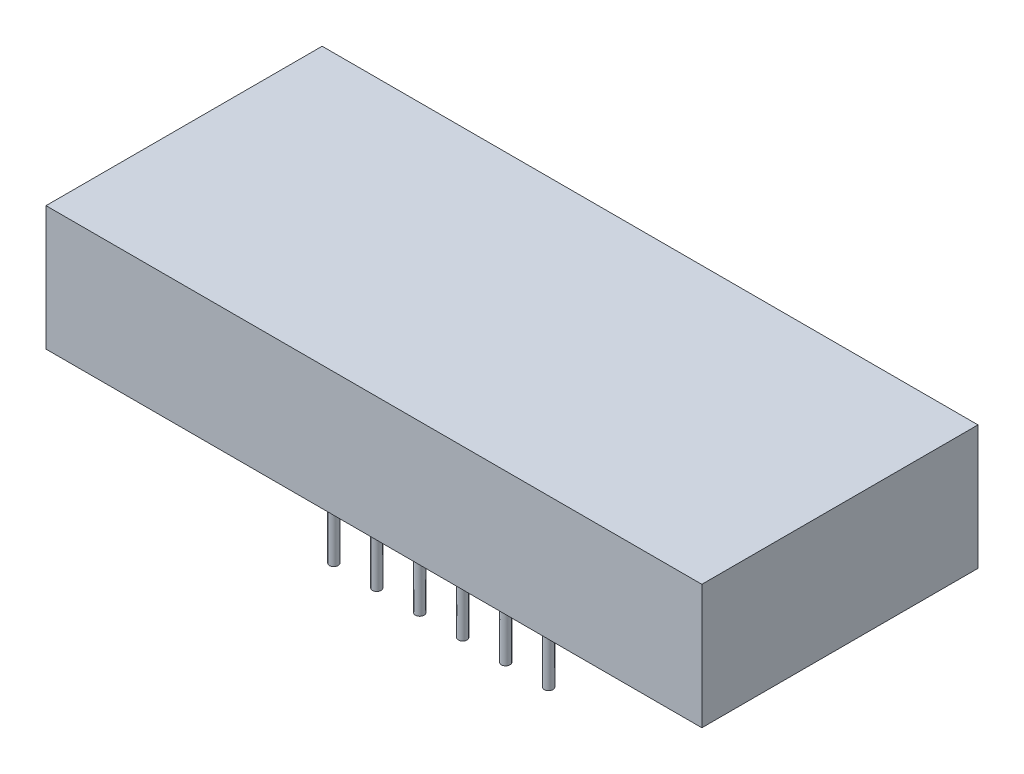
ISO-10303-21;
HEADER;
FILE_DESCRIPTION(('STEP AP214'),'2;1');
FILE_NAME('part.step','',(''),(''),'','','');
FILE_SCHEMA(('AUTOMOTIVE_DESIGN { 1 0 10303 214 1 1 1 1 }'));
ENDSEC;
DATA;
#1=APPLICATION_CONTEXT('core data for automotive mechanical design processes');
#2=APPLICATION_PROTOCOL_DEFINITION('international standard','automotive_design',2000,#1);
#3=PRODUCT_CONTEXT('',#1,'mechanical');
#4=PRODUCT('Part','Part','',(#3));
#5=PRODUCT_RELATED_PRODUCT_CATEGORY('part','',(#4));
#6=PRODUCT_DEFINITION_FORMATION('','',#4);
#7=PRODUCT_DEFINITION_CONTEXT('part definition',#1,'design');
#8=PRODUCT_DEFINITION('design','',#6,#7);
#9=PRODUCT_DEFINITION_SHAPE('','',#8);
#10=(LENGTH_UNIT() NAMED_UNIT(*) SI_UNIT(.MILLI.,.METRE.));
#11=(NAMED_UNIT(*) PLANE_ANGLE_UNIT() SI_UNIT($,.RADIAN.));
#12=(NAMED_UNIT(*) SI_UNIT($,.STERADIAN.) SOLID_ANGLE_UNIT());
#13=UNCERTAINTY_MEASURE_WITH_UNIT(LENGTH_MEASURE(1.E-05),#10,'distance_accuracy_value','');
#14=(GEOMETRIC_REPRESENTATION_CONTEXT(3) GLOBAL_UNCERTAINTY_ASSIGNED_CONTEXT((#13)) GLOBAL_UNIT_ASSIGNED_CONTEXT((#10,
#11,#12)) REPRESENTATION_CONTEXT('',''));
#15=CARTESIAN_POINT('',(0.,0.,0.));
#16=DIRECTION('',(0.,0.,1.));
#17=DIRECTION('',(1.,0.,0.));
#18=AXIS2_PLACEMENT_3D('',#15,#16,#17);
#19=CARTESIAN_POINT('',(-19.,0.,8.));
#20=DIRECTION('',(0.,1.,0.));
#21=DIRECTION('',(0.,0.,1.));
#22=AXIS2_PLACEMENT_3D('',#19,#20,#21);
#23=PLANE('',#22);
#24=CARTESIAN_POINT('',(3.73481199421592,0.,-4.1));
#25=DIRECTION('',(0.,1.,0.));
#26=DIRECTION('',(0.,0.,1.));
#27=AXIS2_PLACEMENT_3D('',#24,#25,#26);
#28=CIRCLE('',#27,0.250000000000001);
#29=CARTESIAN_POINT('',(3.73481199421592,0.,-3.85));
#30=VERTEX_POINT('',#29);
#31=EDGE_CURVE('E40',#30,#30,#28,.F.);
#32=ORIENTED_EDGE('',*,*,#31,.F.);
#33=EDGE_LOOP('',(#32));
#34=FACE_BOUND('',#33,.T.);
#35=CARTESIAN_POINT('',(-1.2449373314053,0.,-4.1));
#36=DIRECTION('',(0.,1.,0.));
#37=DIRECTION('',(0.,0.,1.));
#38=AXIS2_PLACEMENT_3D('',#35,#36,#37);
#39=CIRCLE('',#38,0.25);
#40=CARTESIAN_POINT('',(-1.2449373314053,0.,-3.85));
#41=VERTEX_POINT('',#40);
#42=EDGE_CURVE('E138',#41,#41,#39,.F.);
#43=ORIENTED_EDGE('',*,*,#42,.F.);
#44=EDGE_LOOP('',(#43));
#45=FACE_BOUND('',#44,.T.);
#46=CARTESIAN_POINT('',(-6.22468665702653,0.,-4.10000000000001));
#47=DIRECTION('',(0.,1.,0.));
#48=DIRECTION('',(0.,0.,1.));
#49=AXIS2_PLACEMENT_3D('',#46,#47,#48);
#50=CIRCLE('',#49,0.25);
#51=CARTESIAN_POINT('',(-6.22468665702653,0.,-3.85000000000001));
#52=VERTEX_POINT('',#51);
#53=EDGE_CURVE('E132',#52,#52,#50,.F.);
#54=ORIENTED_EDGE('',*,*,#53,.F.);
#55=EDGE_LOOP('',(#54));
#56=FACE_BOUND('',#55,.T.);
#57=CARTESIAN_POINT('',(-3.73481199421592,0.,4.1));
#58=DIRECTION('',(0.,1.,0.));
#59=DIRECTION('',(0.,0.,1.));
#60=AXIS2_PLACEMENT_3D('',#57,#58,#59);
#61=CIRCLE('',#60,0.25);
#62=CARTESIAN_POINT('',(-3.73481199421592,0.,4.35));
#63=VERTEX_POINT('',#62);
#64=EDGE_CURVE('E126',#63,#63,#61,.F.);
#65=ORIENTED_EDGE('',*,*,#64,.F.);
#66=EDGE_LOOP('',(#65));
#67=FACE_BOUND('',#66,.T.);
#68=CARTESIAN_POINT('',(1.24493733140531,0.,4.1));
#69=DIRECTION('',(0.,1.,0.));
#70=DIRECTION('',(0.,0.,1.));
#71=AXIS2_PLACEMENT_3D('',#68,#69,#70);
#72=CIRCLE('',#71,0.25);
#73=CARTESIAN_POINT('',(1.24493733140531,0.,4.35));
#74=VERTEX_POINT('',#73);
#75=EDGE_CURVE('E120',#74,#74,#72,.F.);
#76=ORIENTED_EDGE('',*,*,#75,.F.);
#77=EDGE_LOOP('',(#76));
#78=FACE_BOUND('',#77,.T.);
#79=CARTESIAN_POINT('',(6.22468665702653,0.,4.1));
#80=DIRECTION('',(0.,1.,0.));
#81=DIRECTION('',(0.,0.,1.));
#82=AXIS2_PLACEMENT_3D('',#79,#80,#81);
#83=CIRCLE('',#82,0.25);
#84=CARTESIAN_POINT('',(6.22468665702653,0.,4.35));
#85=VERTEX_POINT('',#84);
#86=EDGE_CURVE('E90',#85,#85,#83,.F.);
#87=ORIENTED_EDGE('',*,*,#86,.F.);
#88=EDGE_LOOP('',(#87));
#89=FACE_BOUND('',#88,.T.);
#90=DIRECTION('',(0.,0.,1.));
#91=VECTOR('',#90,1.);
#92=CARTESIAN_POINT('',(-19.,0.,-8.));
#93=LINE('',#92,#91);
#94=CARTESIAN_POINT('',(-19.,0.,-8.));
#95=VERTEX_POINT('',#94);
#96=CARTESIAN_POINT('',(-19.,0.,8.));
#97=VERTEX_POINT('',#96);
#98=EDGE_CURVE('E78',#95,#97,#93,.T.);
#99=ORIENTED_EDGE('',*,*,#98,.F.);
#100=DIRECTION('',(-1.,0.,0.));
#101=VECTOR('',#100,1.);
#102=CARTESIAN_POINT('',(-19.,0.,-8.));
#103=LINE('',#102,#101);
#104=CARTESIAN_POINT('',(19.,0.,-8.00000000000001));
#105=VERTEX_POINT('',#104);
#106=EDGE_CURVE('E103',#105,#95,#103,.T.);
#107=ORIENTED_EDGE('',*,*,#106,.F.);
#108=DIRECTION('',(0.,0.,-1.));
#109=VECTOR('',#108,1.);
#110=CARTESIAN_POINT('',(19.,0.,-8.00000000000001));
#111=LINE('',#110,#109);
#112=CARTESIAN_POINT('',(19.,0.,7.99999999999999));
#113=VERTEX_POINT('',#112);
#114=EDGE_CURVE('E79',#113,#105,#111,.T.);
#115=ORIENTED_EDGE('',*,*,#114,.F.);
#116=DIRECTION('',(1.,0.,0.));
#117=VECTOR('',#116,1.);
#118=CARTESIAN_POINT('',(-19.,0.,8.));
#119=LINE('',#118,#117);
#120=EDGE_CURVE('E73',#97,#113,#119,.T.);
#121=ORIENTED_EDGE('',*,*,#120,.F.);
#122=EDGE_LOOP('',(#99,#107,#115,#121));
#123=FACE_BOUND('',#122,.T.);
#124=CARTESIAN_POINT('',(3.73481199421592,0.,4.1));
#125=DIRECTION('',(0.,1.,0.));
#126=DIRECTION('',(0.,0.,1.));
#127=AXIS2_PLACEMENT_3D('',#124,#125,#126);
#128=CIRCLE('',#127,0.250000000000001);
#129=CARTESIAN_POINT('',(3.73481199421592,0.,4.35));
#130=VERTEX_POINT('',#129);
#131=EDGE_CURVE('E117',#130,#130,#128,.F.);
#132=ORIENTED_EDGE('',*,*,#131,.F.);
#133=EDGE_LOOP('',(#132));
#134=FACE_BOUND('',#133,.T.);
#135=CARTESIAN_POINT('',(-1.24493733140531,0.,4.1));
#136=DIRECTION('',(0.,1.,0.));
#137=DIRECTION('',(0.,0.,1.));
#138=AXIS2_PLACEMENT_3D('',#135,#136,#137);
#139=CIRCLE('',#138,0.25);
#140=CARTESIAN_POINT('',(-1.24493733140531,0.,4.35));
#141=VERTEX_POINT('',#140);
#142=EDGE_CURVE('E123',#141,#141,#139,.F.);
#143=ORIENTED_EDGE('',*,*,#142,.F.);
#144=EDGE_LOOP('',(#143));
#145=FACE_BOUND('',#144,.T.);
#146=CARTESIAN_POINT('',(-6.22468665702653,0.,4.1));
#147=DIRECTION('',(0.,1.,0.));
#148=DIRECTION('',(0.,0.,1.));
#149=AXIS2_PLACEMENT_3D('',#146,#147,#148);
#150=CIRCLE('',#149,0.25);
#151=CARTESIAN_POINT('',(-6.22468665702653,0.,4.35));
#152=VERTEX_POINT('',#151);
#153=EDGE_CURVE('E129',#152,#152,#150,.F.);
#154=ORIENTED_EDGE('',*,*,#153,.F.);
#155=EDGE_LOOP('',(#154));
#156=FACE_BOUND('',#155,.T.);
#157=CARTESIAN_POINT('',(-3.73481199421592,0.,-4.10000000000001));
#158=DIRECTION('',(0.,1.,0.));
#159=DIRECTION('',(0.,0.,1.));
#160=AXIS2_PLACEMENT_3D('',#157,#158,#159);
#161=CIRCLE('',#160,0.25);
#162=CARTESIAN_POINT('',(-3.73481199421592,0.,-3.85000000000001));
#163=VERTEX_POINT('',#162);
#164=EDGE_CURVE('E135',#163,#163,#161,.F.);
#165=ORIENTED_EDGE('',*,*,#164,.F.);
#166=EDGE_LOOP('',(#165));
#167=FACE_BOUND('',#166,.T.);
#168=CARTESIAN_POINT('',(1.24493733140531,0.,-4.1));
#169=DIRECTION('',(0.,1.,0.));
#170=DIRECTION('',(0.,0.,1.));
#171=AXIS2_PLACEMENT_3D('',#168,#169,#170);
#172=CIRCLE('',#171,0.25);
#173=CARTESIAN_POINT('',(1.24493733140531,0.,-3.85));
#174=VERTEX_POINT('',#173);
#175=EDGE_CURVE('E141',#174,#174,#172,.F.);
#176=ORIENTED_EDGE('',*,*,#175,.F.);
#177=EDGE_LOOP('',(#176));
#178=FACE_BOUND('',#177,.T.);
#179=CARTESIAN_POINT('',(6.22468665702653,0.,-4.1));
#180=DIRECTION('',(0.,1.,0.));
#181=DIRECTION('',(0.,0.,1.));
#182=AXIS2_PLACEMENT_3D('',#179,#180,#181);
#183=CIRCLE('',#182,0.25);
#184=CARTESIAN_POINT('',(6.22468665702653,0.,-3.85));
#185=VERTEX_POINT('',#184);
#186=EDGE_CURVE('E11',#185,#185,#183,.F.);
#187=ORIENTED_EDGE('',*,*,#186,.F.);
#188=EDGE_LOOP('',(#187));
#189=FACE_BOUND('',#188,.T.);
#190=ADVANCED_FACE('F32',(#34,#45,#56,#67,#78,#89,#123,#134,#145,#156,#167,#178,#189),#23,.F.);
#191=CARTESIAN_POINT('',(-19.,7.2,-8.));
#192=DIRECTION('',(1.,0.,0.));
#193=DIRECTION('',(0.,0.,-1.));
#194=AXIS2_PLACEMENT_3D('',#191,#192,#193);
#195=PLANE('',#194);
#196=ORIENTED_EDGE('',*,*,#98,.T.);
#197=DIRECTION('',(0.,-1.,0.));
#198=VECTOR('',#197,1.);
#199=CARTESIAN_POINT('',(-19.,7.2,8.));
#200=LINE('',#199,#198);
#201=CARTESIAN_POINT('',(-19.,7.2,8.));
#202=VERTEX_POINT('',#201);
#203=EDGE_CURVE('E85',#202,#97,#200,.T.);
#204=ORIENTED_EDGE('',*,*,#203,.F.);
#205=DIRECTION('',(0.,0.,1.));
#206=VECTOR('',#205,1.);
#207=CARTESIAN_POINT('',(-19.,7.2,-8.));
#208=LINE('',#207,#206);
#209=CARTESIAN_POINT('',(-19.,7.2,-8.));
#210=VERTEX_POINT('',#209);
#211=EDGE_CURVE('E105',#210,#202,#208,.T.);
#212=ORIENTED_EDGE('',*,*,#211,.F.);
#213=DIRECTION('',(0.,-1.,0.));
#214=VECTOR('',#213,1.);
#215=CARTESIAN_POINT('',(-19.,7.2,-8.));
#216=LINE('',#215,#214);
#217=EDGE_CURVE('E94',#210,#95,#216,.T.);
#218=ORIENTED_EDGE('',*,*,#217,.T.);
#219=EDGE_LOOP('',(#196,#204,#212,#218));
#220=FACE_BOUND('',#219,.T.);
#221=ADVANCED_FACE('F34',(#220),#195,.F.);
#222=CARTESIAN_POINT('',(-19.,7.2,8.));
#223=DIRECTION('',(0.,0.,-1.));
#224=DIRECTION('',(-1.,0.,0.));
#225=AXIS2_PLACEMENT_3D('',#222,#223,#224);
#226=PLANE('',#225);
#227=ORIENTED_EDGE('',*,*,#120,.T.);
#228=DIRECTION('',(0.,-1.,0.));
#229=VECTOR('',#228,1.);
#230=CARTESIAN_POINT('',(19.,7.2,7.99999999999999));
#231=LINE('',#230,#229);
#232=CARTESIAN_POINT('',(19.,7.2,7.99999999999999));
#233=VERTEX_POINT('',#232);
#234=EDGE_CURVE('E91',#233,#113,#231,.T.);
#235=ORIENTED_EDGE('',*,*,#234,.F.);
#236=DIRECTION('',(1.,0.,0.));
#237=VECTOR('',#236,1.);
#238=CARTESIAN_POINT('',(-19.,7.2,8.));
#239=LINE('',#238,#237);
#240=EDGE_CURVE('E87',#202,#233,#239,.T.);
#241=ORIENTED_EDGE('',*,*,#240,.F.);
#242=ORIENTED_EDGE('',*,*,#203,.T.);
#243=EDGE_LOOP('',(#227,#235,#241,#242));
#244=FACE_BOUND('',#243,.T.);
#245=ADVANCED_FACE('F86',(#244),#226,.F.);
#246=CARTESIAN_POINT('',(19.,7.2,-8.00000000000001));
#247=DIRECTION('',(-1.,0.,0.));
#248=DIRECTION('',(0.,0.,1.));
#249=AXIS2_PLACEMENT_3D('',#246,#247,#248);
#250=PLANE('',#249);
#251=ORIENTED_EDGE('',*,*,#114,.T.);
#252=DIRECTION('',(0.,-1.,0.));
#253=VECTOR('',#252,1.);
#254=CARTESIAN_POINT('',(19.,7.2,-8.00000000000001));
#255=LINE('',#254,#253);
#256=CARTESIAN_POINT('',(19.,7.2,-8.00000000000001));
#257=VERTEX_POINT('',#256);
#258=EDGE_CURVE('E111',#257,#105,#255,.T.);
#259=ORIENTED_EDGE('',*,*,#258,.F.);
#260=DIRECTION('',(0.,0.,-1.));
#261=VECTOR('',#260,1.);
#262=CARTESIAN_POINT('',(19.,7.2,-8.00000000000001));
#263=LINE('',#262,#261);
#264=EDGE_CURVE('E52',#233,#257,#263,.T.);
#265=ORIENTED_EDGE('',*,*,#264,.F.);
#266=ORIENTED_EDGE('',*,*,#234,.T.);
#267=EDGE_LOOP('',(#251,#259,#265,#266));
#268=FACE_BOUND('',#267,.T.);
#269=ADVANCED_FACE('F181',(#268),#250,.F.);
#270=CARTESIAN_POINT('',(-19.,7.2,-8.));
#271=DIRECTION('',(0.,0.,1.));
#272=DIRECTION('',(1.,0.,0.));
#273=AXIS2_PLACEMENT_3D('',#270,#271,#272);
#274=PLANE('',#273);
#275=ORIENTED_EDGE('',*,*,#106,.T.);
#276=ORIENTED_EDGE('',*,*,#217,.F.);
#277=DIRECTION('',(-1.,0.,0.));
#278=VECTOR('',#277,1.);
#279=CARTESIAN_POINT('',(-19.,7.2,-8.));
#280=LINE('',#279,#278);
#281=EDGE_CURVE('E47',#257,#210,#280,.T.);
#282=ORIENTED_EDGE('',*,*,#281,.F.);
#283=ORIENTED_EDGE('',*,*,#258,.T.);
#284=EDGE_LOOP('',(#275,#276,#282,#283));
#285=FACE_BOUND('',#284,.T.);
#286=ADVANCED_FACE('F174',(#285),#274,.F.);
#287=CARTESIAN_POINT('',(-19.,7.2,8.));
#288=DIRECTION('',(0.,1.,0.));
#289=DIRECTION('',(0.,0.,1.));
#290=AXIS2_PLACEMENT_3D('',#287,#288,#289);
#291=PLANE('',#290);
#292=ORIENTED_EDGE('',*,*,#211,.T.);
#293=ORIENTED_EDGE('',*,*,#240,.T.);
#294=ORIENTED_EDGE('',*,*,#264,.T.);
#295=ORIENTED_EDGE('',*,*,#281,.T.);
#296=EDGE_LOOP('',(#292,#293,#294,#295));
#297=FACE_BOUND('',#296,.T.);
#298=ADVANCED_FACE('F164',(#297),#291,.T.);
#299=CARTESIAN_POINT('',(6.22468665702653,-6.3,4.1));
#300=DIRECTION('',(0.,1.,0.));
#301=DIRECTION('',(0.,0.,1.));
#302=AXIS2_PLACEMENT_3D('',#299,#300,#301);
#303=CYLINDRICAL_SURFACE('',#302,0.25);
#304=CARTESIAN_POINT('',(6.22468665702653,-6.3,4.1));
#305=DIRECTION('',(0.,-1.,0.));
#306=DIRECTION('',(0.,0.,-1.));
#307=AXIS2_PLACEMENT_3D('',#304,#305,#306);
#308=CIRCLE('',#307,0.25);
#309=CARTESIAN_POINT('',(6.22468665702653,-6.3,3.85));
#310=VERTEX_POINT('',#309);
#311=EDGE_CURVE('E95',#310,#310,#308,.T.);
#312=ORIENTED_EDGE('',*,*,#311,.F.);
#313=EDGE_LOOP('',(#312));
#314=FACE_BOUND('',#313,.T.);
#315=ORIENTED_EDGE('',*,*,#86,.T.);
#316=EDGE_LOOP('',(#315));
#317=FACE_BOUND('',#316,.T.);
#318=ADVANCED_FACE('F161',(#314,#317),#303,.T.);
#319=CARTESIAN_POINT('',(6.22468665702653,-6.3,4.1));
#320=DIRECTION('',(0.,-1.,0.));
#321=DIRECTION('',(0.,0.,-1.));
#322=AXIS2_PLACEMENT_3D('',#319,#320,#321);
#323=PLANE('',#322);
#324=ORIENTED_EDGE('',*,*,#311,.T.);
#325=EDGE_LOOP('',(#324));
#326=FACE_BOUND('',#325,.T.);
#327=ADVANCED_FACE('F163',(#326),#323,.T.);
#328=CARTESIAN_POINT('',(3.73481199421592,-6.3,4.1));
#329=DIRECTION('',(0.,1.,0.));
#330=DIRECTION('',(0.,0.,1.));
#331=AXIS2_PLACEMENT_3D('',#328,#329,#330);
#332=CYLINDRICAL_SURFACE('',#331,0.250000000000001);
#333=CARTESIAN_POINT('',(3.73481199421592,-6.3,4.1));
#334=DIRECTION('',(0.,-1.,0.));
#335=DIRECTION('',(0.,0.,-1.));
#336=AXIS2_PLACEMENT_3D('',#333,#334,#335);
#337=CIRCLE('',#336,0.250000000000001);
#338=CARTESIAN_POINT('',(3.73481199421592,-6.3,3.85));
#339=VERTEX_POINT('',#338);
#340=EDGE_CURVE('E98',#339,#339,#337,.T.);
#341=ORIENTED_EDGE('',*,*,#340,.F.);
#342=EDGE_LOOP('',(#341));
#343=FACE_BOUND('',#342,.T.);
#344=ORIENTED_EDGE('',*,*,#131,.T.);
#345=EDGE_LOOP('',(#344));
#346=FACE_BOUND('',#345,.T.);
#347=ADVANCED_FACE('F171',(#343,#346),#332,.T.);
#348=CARTESIAN_POINT('',(3.73481199421592,-6.3,4.1));
#349=DIRECTION('',(0.,-1.,0.));
#350=DIRECTION('',(0.,0.,-1.));
#351=AXIS2_PLACEMENT_3D('',#348,#349,#350);
#352=PLANE('',#351);
#353=ORIENTED_EDGE('',*,*,#340,.T.);
#354=EDGE_LOOP('',(#353));
#355=FACE_BOUND('',#354,.T.);
#356=ADVANCED_FACE('F218',(#355),#352,.T.);
#357=CARTESIAN_POINT('',(1.24493733140531,-6.3,4.1));
#358=DIRECTION('',(0.,1.,0.));
#359=DIRECTION('',(0.,0.,1.));
#360=AXIS2_PLACEMENT_3D('',#357,#358,#359);
#361=CYLINDRICAL_SURFACE('',#360,0.25);
#362=CARTESIAN_POINT('',(1.24493733140531,-6.3,4.1));
#363=DIRECTION('',(0.,-1.,0.));
#364=DIRECTION('',(0.,0.,-1.));
#365=AXIS2_PLACEMENT_3D('',#362,#363,#364);
#366=CIRCLE('',#365,0.25);
#367=CARTESIAN_POINT('',(1.24493733140531,-6.3,3.85));
#368=VERTEX_POINT('',#367);
#369=EDGE_CURVE('E459',#368,#368,#366,.T.);
#370=ORIENTED_EDGE('',*,*,#369,.F.);
#371=EDGE_LOOP('',(#370));
#372=FACE_BOUND('',#371,.T.);
#373=ORIENTED_EDGE('',*,*,#75,.T.);
#374=EDGE_LOOP('',(#373));
#375=FACE_BOUND('',#374,.T.);
#376=ADVANCED_FACE('F227',(#372,#375),#361,.T.);
#377=CARTESIAN_POINT('',(1.24493733140531,-6.3,4.1));
#378=DIRECTION('',(0.,-1.,0.));
#379=DIRECTION('',(0.,0.,-1.));
#380=AXIS2_PLACEMENT_3D('',#377,#378,#379);
#381=PLANE('',#380);
#382=ORIENTED_EDGE('',*,*,#369,.T.);
#383=EDGE_LOOP('',(#382));
#384=FACE_BOUND('',#383,.T.);
#385=ADVANCED_FACE('F237',(#384),#381,.T.);
#386=CARTESIAN_POINT('',(-1.24493733140531,-6.3,4.1));
#387=DIRECTION('',(0.,1.,0.));
#388=DIRECTION('',(0.,0.,1.));
#389=AXIS2_PLACEMENT_3D('',#386,#387,#388);
#390=CYLINDRICAL_SURFACE('',#389,0.25);
#391=CARTESIAN_POINT('',(-1.24493733140531,-6.3,4.1));
#392=DIRECTION('',(0.,-1.,0.));
#393=DIRECTION('',(0.,0.,-1.));
#394=AXIS2_PLACEMENT_3D('',#391,#392,#393);
#395=CIRCLE('',#394,0.25);
#396=CARTESIAN_POINT('',(-1.24493733140531,-6.3,3.85));
#397=VERTEX_POINT('',#396);
#398=EDGE_CURVE('E456',#397,#397,#395,.T.);
#399=ORIENTED_EDGE('',*,*,#398,.F.);
#400=EDGE_LOOP('',(#399));
#401=FACE_BOUND('',#400,.T.);
#402=ORIENTED_EDGE('',*,*,#142,.T.);
#403=EDGE_LOOP('',(#402));
#404=FACE_BOUND('',#403,.T.);
#405=ADVANCED_FACE('F247',(#401,#404),#390,.T.);
#406=CARTESIAN_POINT('',(-1.24493733140531,-6.3,4.1));
#407=DIRECTION('',(0.,-1.,0.));
#408=DIRECTION('',(0.,0.,-1.));
#409=AXIS2_PLACEMENT_3D('',#406,#407,#408);
#410=PLANE('',#409);
#411=ORIENTED_EDGE('',*,*,#398,.T.);
#412=EDGE_LOOP('',(#411));
#413=FACE_BOUND('',#412,.T.);
#414=ADVANCED_FACE('F257',(#413),#410,.T.);
#415=CARTESIAN_POINT('',(-3.73481199421592,-6.3,4.1));
#416=DIRECTION('',(0.,1.,0.));
#417=DIRECTION('',(0.,0.,1.));
#418=AXIS2_PLACEMENT_3D('',#415,#416,#417);
#419=CYLINDRICAL_SURFACE('',#418,0.25);
#420=CARTESIAN_POINT('',(-3.73481199421592,-6.3,4.1));
#421=DIRECTION('',(0.,-1.,0.));
#422=DIRECTION('',(0.,0.,-1.));
#423=AXIS2_PLACEMENT_3D('',#420,#421,#422);
#424=CIRCLE('',#423,0.25);
#425=CARTESIAN_POINT('',(-3.73481199421592,-6.3,3.85));
#426=VERTEX_POINT('',#425);
#427=EDGE_CURVE('E453',#426,#426,#424,.T.);
#428=ORIENTED_EDGE('',*,*,#427,.F.);
#429=EDGE_LOOP('',(#428));
#430=FACE_BOUND('',#429,.T.);
#431=ORIENTED_EDGE('',*,*,#64,.T.);
#432=EDGE_LOOP('',(#431));
#433=FACE_BOUND('',#432,.T.);
#434=ADVANCED_FACE('F267',(#430,#433),#419,.T.);
#435=CARTESIAN_POINT('',(-3.73481199421592,-6.3,4.1));
#436=DIRECTION('',(0.,-1.,0.));
#437=DIRECTION('',(0.,0.,-1.));
#438=AXIS2_PLACEMENT_3D('',#435,#436,#437);
#439=PLANE('',#438);
#440=ORIENTED_EDGE('',*,*,#427,.T.);
#441=EDGE_LOOP('',(#440));
#442=FACE_BOUND('',#441,.T.);
#443=ADVANCED_FACE('F277',(#442),#439,.T.);
#444=CARTESIAN_POINT('',(-6.22468665702653,-6.3,4.1));
#445=DIRECTION('',(0.,1.,0.));
#446=DIRECTION('',(0.,0.,1.));
#447=AXIS2_PLACEMENT_3D('',#444,#445,#446);
#448=CYLINDRICAL_SURFACE('',#447,0.25);
#449=CARTESIAN_POINT('',(-6.22468665702653,-6.3,4.1));
#450=DIRECTION('',(0.,-1.,0.));
#451=DIRECTION('',(0.,0.,-1.));
#452=AXIS2_PLACEMENT_3D('',#449,#450,#451);
#453=CIRCLE('',#452,0.25);
#454=CARTESIAN_POINT('',(-6.22468665702653,-6.3,3.85));
#455=VERTEX_POINT('',#454);
#456=EDGE_CURVE('E450',#455,#455,#453,.T.);
#457=ORIENTED_EDGE('',*,*,#456,.F.);
#458=EDGE_LOOP('',(#457));
#459=FACE_BOUND('',#458,.T.);
#460=ORIENTED_EDGE('',*,*,#153,.T.);
#461=EDGE_LOOP('',(#460));
#462=FACE_BOUND('',#461,.T.);
#463=ADVANCED_FACE('F287',(#459,#462),#448,.T.);
#464=CARTESIAN_POINT('',(-6.22468665702653,-6.3,4.1));
#465=DIRECTION('',(0.,-1.,0.));
#466=DIRECTION('',(0.,0.,-1.));
#467=AXIS2_PLACEMENT_3D('',#464,#465,#466);
#468=PLANE('',#467);
#469=ORIENTED_EDGE('',*,*,#456,.T.);
#470=EDGE_LOOP('',(#469));
#471=FACE_BOUND('',#470,.T.);
#472=ADVANCED_FACE('F297',(#471),#468,.T.);
#473=CARTESIAN_POINT('',(-6.22468665702653,-6.3,-4.10000000000001));
#474=DIRECTION('',(0.,1.,0.));
#475=DIRECTION('',(0.,0.,1.));
#476=AXIS2_PLACEMENT_3D('',#473,#474,#475);
#477=CYLINDRICAL_SURFACE('',#476,0.25);
#478=CARTESIAN_POINT('',(-6.22468665702653,-6.3,-4.10000000000001));
#479=DIRECTION('',(0.,-1.,0.));
#480=DIRECTION('',(0.,0.,1.));
#481=AXIS2_PLACEMENT_3D('',#478,#479,#480);
#482=CIRCLE('',#481,0.25);
#483=CARTESIAN_POINT('',(-6.22468665702653,-6.3,-3.85000000000001));
#484=VERTEX_POINT('',#483);
#485=EDGE_CURVE('E447',#484,#484,#482,.T.);
#486=ORIENTED_EDGE('',*,*,#485,.F.);
#487=EDGE_LOOP('',(#486));
#488=FACE_BOUND('',#487,.T.);
#489=ORIENTED_EDGE('',*,*,#53,.T.);
#490=EDGE_LOOP('',(#489));
#491=FACE_BOUND('',#490,.T.);
#492=ADVANCED_FACE('F307',(#488,#491),#477,.T.);
#493=CARTESIAN_POINT('',(-6.22468665702653,-6.3,-4.10000000000001));
#494=DIRECTION('',(0.,1.,0.));
#495=DIRECTION('',(0.,0.,1.));
#496=AXIS2_PLACEMENT_3D('',#493,#494,#495);
#497=PLANE('',#496);
#498=ORIENTED_EDGE('',*,*,#485,.T.);
#499=EDGE_LOOP('',(#498));
#500=FACE_BOUND('',#499,.T.);
#501=ADVANCED_FACE('F317',(#500),#497,.F.);
#502=CARTESIAN_POINT('',(-3.73481199421592,-6.3,-4.10000000000001));
#503=DIRECTION('',(0.,1.,0.));
#504=DIRECTION('',(0.,0.,1.));
#505=AXIS2_PLACEMENT_3D('',#502,#503,#504);
#506=CYLINDRICAL_SURFACE('',#505,0.25);
#507=CARTESIAN_POINT('',(-3.73481199421592,-6.3,-4.10000000000001));
#508=DIRECTION('',(0.,-1.,0.));
#509=DIRECTION('',(0.,0.,1.));
#510=AXIS2_PLACEMENT_3D('',#507,#508,#509);
#511=CIRCLE('',#510,0.25);
#512=CARTESIAN_POINT('',(-3.73481199421592,-6.3,-3.85000000000001));
#513=VERTEX_POINT('',#512);
#514=EDGE_CURVE('E444',#513,#513,#511,.T.);
#515=ORIENTED_EDGE('',*,*,#514,.F.);
#516=EDGE_LOOP('',(#515));
#517=FACE_BOUND('',#516,.T.);
#518=ORIENTED_EDGE('',*,*,#164,.T.);
#519=EDGE_LOOP('',(#518));
#520=FACE_BOUND('',#519,.T.);
#521=ADVANCED_FACE('F327',(#517,#520),#506,.T.);
#522=CARTESIAN_POINT('',(-3.73481199421592,-6.3,-4.10000000000001));
#523=DIRECTION('',(0.,1.,0.));
#524=DIRECTION('',(0.,0.,1.));
#525=AXIS2_PLACEMENT_3D('',#522,#523,#524);
#526=PLANE('',#525);
#527=ORIENTED_EDGE('',*,*,#514,.T.);
#528=EDGE_LOOP('',(#527));
#529=FACE_BOUND('',#528,.T.);
#530=ADVANCED_FACE('F337',(#529),#526,.F.);
#531=CARTESIAN_POINT('',(-1.2449373314053,-6.3,-4.1));
#532=DIRECTION('',(0.,1.,0.));
#533=DIRECTION('',(0.,0.,1.));
#534=AXIS2_PLACEMENT_3D('',#531,#532,#533);
#535=CYLINDRICAL_SURFACE('',#534,0.25);
#536=CARTESIAN_POINT('',(-1.2449373314053,-6.3,-4.1));
#537=DIRECTION('',(0.,-1.,0.));
#538=DIRECTION('',(0.,0.,1.));
#539=AXIS2_PLACEMENT_3D('',#536,#537,#538);
#540=CIRCLE('',#539,0.25);
#541=CARTESIAN_POINT('',(-1.2449373314053,-6.3,-3.85));
#542=VERTEX_POINT('',#541);
#543=EDGE_CURVE('E441',#542,#542,#540,.T.);
#544=ORIENTED_EDGE('',*,*,#543,.F.);
#545=EDGE_LOOP('',(#544));
#546=FACE_BOUND('',#545,.T.);
#547=ORIENTED_EDGE('',*,*,#42,.T.);
#548=EDGE_LOOP('',(#547));
#549=FACE_BOUND('',#548,.T.);
#550=ADVANCED_FACE('F347',(#546,#549),#535,.T.);
#551=CARTESIAN_POINT('',(-1.2449373314053,-6.3,-4.1));
#552=DIRECTION('',(0.,1.,0.));
#553=DIRECTION('',(0.,0.,1.));
#554=AXIS2_PLACEMENT_3D('',#551,#552,#553);
#555=PLANE('',#554);
#556=ORIENTED_EDGE('',*,*,#543,.T.);
#557=EDGE_LOOP('',(#556));
#558=FACE_BOUND('',#557,.T.);
#559=ADVANCED_FACE('F357',(#558),#555,.F.);
#560=CARTESIAN_POINT('',(1.24493733140531,-6.3,-4.1));
#561=DIRECTION('',(0.,1.,0.));
#562=DIRECTION('',(0.,0.,1.));
#563=AXIS2_PLACEMENT_3D('',#560,#561,#562);
#564=CYLINDRICAL_SURFACE('',#563,0.25);
#565=CARTESIAN_POINT('',(1.24493733140531,-6.3,-4.1));
#566=DIRECTION('',(0.,-1.,0.));
#567=DIRECTION('',(0.,0.,1.));
#568=AXIS2_PLACEMENT_3D('',#565,#566,#567);
#569=CIRCLE('',#568,0.25);
#570=CARTESIAN_POINT('',(1.24493733140531,-6.3,-3.85));
#571=VERTEX_POINT('',#570);
#572=EDGE_CURVE('E436',#571,#571,#569,.T.);
#573=ORIENTED_EDGE('',*,*,#572,.F.);
#574=EDGE_LOOP('',(#573));
#575=FACE_BOUND('',#574,.T.);
#576=ORIENTED_EDGE('',*,*,#175,.T.);
#577=EDGE_LOOP('',(#576));
#578=FACE_BOUND('',#577,.T.);
#579=ADVANCED_FACE('F367',(#575,#578),#564,.T.);
#580=CARTESIAN_POINT('',(1.24493733140531,-6.3,-4.1));
#581=DIRECTION('',(0.,1.,0.));
#582=DIRECTION('',(0.,0.,1.));
#583=AXIS2_PLACEMENT_3D('',#580,#581,#582);
#584=PLANE('',#583);
#585=ORIENTED_EDGE('',*,*,#572,.T.);
#586=EDGE_LOOP('',(#585));
#587=FACE_BOUND('',#586,.T.);
#588=ADVANCED_FACE('F377',(#587),#584,.F.);
#589=CARTESIAN_POINT('',(3.73481199421592,-6.3,-4.1));
#590=DIRECTION('',(0.,1.,0.));
#591=DIRECTION('',(0.,0.,1.));
#592=AXIS2_PLACEMENT_3D('',#589,#590,#591);
#593=CYLINDRICAL_SURFACE('',#592,0.250000000000001);
#594=CARTESIAN_POINT('',(3.73481199421592,-6.3,-4.1));
#595=DIRECTION('',(0.,-1.,0.));
#596=DIRECTION('',(0.,0.,1.));
#597=AXIS2_PLACEMENT_3D('',#594,#595,#596);
#598=CIRCLE('',#597,0.250000000000001);
#599=CARTESIAN_POINT('',(3.73481199421592,-6.3,-3.85));
#600=VERTEX_POINT('',#599);
#601=EDGE_CURVE('E433',#600,#600,#598,.T.);
#602=ORIENTED_EDGE('',*,*,#601,.F.);
#603=EDGE_LOOP('',(#602));
#604=FACE_BOUND('',#603,.T.);
#605=ORIENTED_EDGE('',*,*,#31,.T.);
#606=EDGE_LOOP('',(#605));
#607=FACE_BOUND('',#606,.T.);
#608=ADVANCED_FACE('F146',(#604,#607),#593,.T.);
#609=CARTESIAN_POINT('',(3.73481199421592,-6.3,-4.1));
#610=DIRECTION('',(0.,1.,0.));
#611=DIRECTION('',(0.,0.,1.));
#612=AXIS2_PLACEMENT_3D('',#609,#610,#611);
#613=PLANE('',#612);
#614=ORIENTED_EDGE('',*,*,#601,.T.);
#615=EDGE_LOOP('',(#614));
#616=FACE_BOUND('',#615,.T.);
#617=ADVANCED_FACE('F396',(#616),#613,.F.);
#618=CARTESIAN_POINT('',(6.22468665702653,-6.3,-4.1));
#619=DIRECTION('',(0.,1.,0.));
#620=DIRECTION('',(0.,0.,1.));
#621=AXIS2_PLACEMENT_3D('',#618,#619,#620);
#622=CYLINDRICAL_SURFACE('',#621,0.25);
#623=CARTESIAN_POINT('',(6.22468665702653,-6.3,-4.1));
#624=DIRECTION('',(0.,-1.,0.));
#625=DIRECTION('',(0.,0.,1.));
#626=AXIS2_PLACEMENT_3D('',#623,#624,#625);
#627=CIRCLE('',#626,0.25);
#628=CARTESIAN_POINT('',(6.22468665702653,-6.3,-3.85));
#629=VERTEX_POINT('',#628);
#630=EDGE_CURVE('E432',#629,#629,#627,.T.);
#631=ORIENTED_EDGE('',*,*,#630,.F.);
#632=EDGE_LOOP('',(#631));
#633=FACE_BOUND('',#632,.T.);
#634=ORIENTED_EDGE('',*,*,#186,.T.);
#635=EDGE_LOOP('',(#634));
#636=FACE_BOUND('',#635,.T.);
#637=ADVANCED_FACE('F406',(#633,#636),#622,.T.);
#638=CARTESIAN_POINT('',(6.22468665702653,-6.3,-4.1));
#639=DIRECTION('',(0.,1.,0.));
#640=DIRECTION('',(0.,0.,1.));
#641=AXIS2_PLACEMENT_3D('',#638,#639,#640);
#642=PLANE('',#641);
#643=ORIENTED_EDGE('',*,*,#630,.T.);
#644=EDGE_LOOP('',(#643));
#645=FACE_BOUND('',#644,.T.);
#646=ADVANCED_FACE('F416',(#645),#642,.F.);
#647=CLOSED_SHELL('',(#190,#221,#245,#269,#286,#298,#318,#327,#347,#356,#376,#385,#405,#414,
#434,#443,#463,#472,#492,#501,#521,#530,#550,#559,#579,#588,#608,#617,#637,#646));
#648=MANIFOLD_SOLID_BREP('B2',#647);
#649=ADVANCED_BREP_SHAPE_REPRESENTATION('',(#18,#648),#14);
#650=SHAPE_DEFINITION_REPRESENTATION(#9,#649);
ENDSEC;
END-ISO-10303-21;
